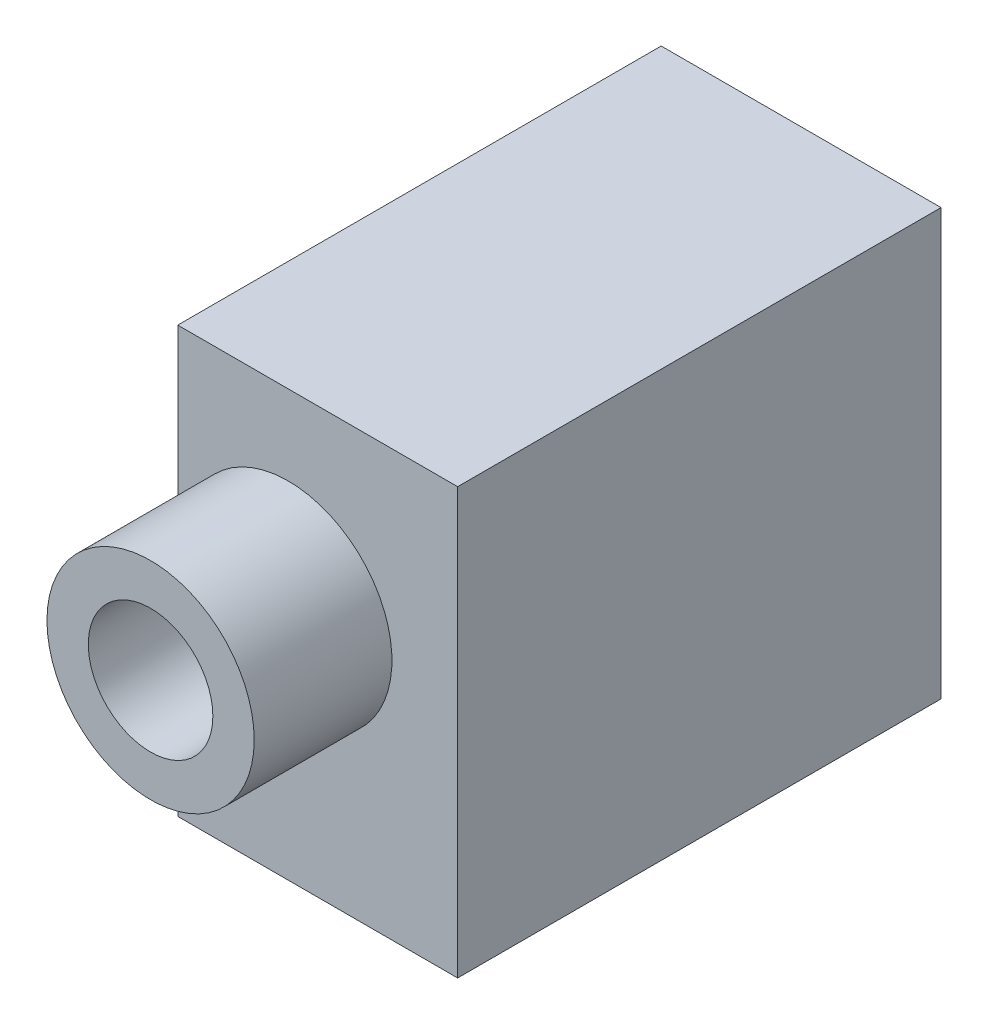
ISO-10303-21;
HEADER;
FILE_DESCRIPTION(('STEP AP214'),'2;1');
FILE_NAME('part.step','',(''),(''),'','','');
FILE_SCHEMA(('AUTOMOTIVE_DESIGN { 1 0 10303 214 1 1 1 1 }'));
ENDSEC;
DATA;
#1=APPLICATION_CONTEXT('core data for automotive mechanical design processes');
#2=APPLICATION_PROTOCOL_DEFINITION('international standard','automotive_design',2000,#1);
#3=PRODUCT_CONTEXT('',#1,'mechanical');
#4=PRODUCT('Part','Part','',(#3));
#5=PRODUCT_RELATED_PRODUCT_CATEGORY('part','',(#4));
#6=PRODUCT_DEFINITION_FORMATION('','',#4);
#7=PRODUCT_DEFINITION_CONTEXT('part definition',#1,'design');
#8=PRODUCT_DEFINITION('design','',#6,#7);
#9=PRODUCT_DEFINITION_SHAPE('','',#8);
#10=(LENGTH_UNIT() NAMED_UNIT(*) SI_UNIT(.MILLI.,.METRE.));
#11=(NAMED_UNIT(*) PLANE_ANGLE_UNIT() SI_UNIT($,.RADIAN.));
#12=(NAMED_UNIT(*) SI_UNIT($,.STERADIAN.) SOLID_ANGLE_UNIT());
#13=UNCERTAINTY_MEASURE_WITH_UNIT(LENGTH_MEASURE(1.E-05),#10,'distance_accuracy_value','');
#14=(GEOMETRIC_REPRESENTATION_CONTEXT(3) GLOBAL_UNCERTAINTY_ASSIGNED_CONTEXT((#13)) GLOBAL_UNIT_ASSIGNED_CONTEXT((#10,
#11,#12)) REPRESENTATION_CONTEXT('',''));
#15=CARTESIAN_POINT('',(0.,0.,0.));
#16=DIRECTION('',(0.,0.,1.));
#17=DIRECTION('',(1.,0.,0.));
#18=AXIS2_PLACEMENT_3D('',#15,#16,#17);
#19=CARTESIAN_POINT('',(-3.2004,12.319,0.));
#20=DIRECTION('',(0.,0.,-1.));
#21=DIRECTION('',(-1.,0.,0.));
#22=AXIS2_PLACEMENT_3D('',#19,#20,#21);
#23=PLANE('',#22);
#24=DIRECTION('',(1.,0.,0.));
#25=VECTOR('',#24,1.);
#26=CARTESIAN_POINT('',(-3.2004,0.,0.));
#27=LINE('',#26,#25);
#28=CARTESIAN_POINT('',(-3.2004,0.,0.));
#29=VERTEX_POINT('',#28);
#30=CARTESIAN_POINT('',(4.9022,0.,0.));
#31=VERTEX_POINT('',#30);
#32=EDGE_CURVE('E93',#29,#31,#27,.T.);
#33=ORIENTED_EDGE('',*,*,#32,.T.);
#34=DIRECTION('',(0.,-1.,0.));
#35=VECTOR('',#34,1.);
#36=CARTESIAN_POINT('',(4.9022,12.319,0.));
#37=LINE('',#36,#35);
#38=CARTESIAN_POINT('',(4.9022,12.319,0.));
#39=VERTEX_POINT('',#38);
#40=EDGE_CURVE('E91',#39,#31,#37,.T.);
#41=ORIENTED_EDGE('',*,*,#40,.F.);
#42=DIRECTION('',(1.,0.,0.));
#43=VECTOR('',#42,1.);
#44=CARTESIAN_POINT('',(-3.2004,12.319,0.));
#45=LINE('',#44,#43);
#46=CARTESIAN_POINT('',(-3.2004,12.319,0.));
#47=VERTEX_POINT('',#46);
#48=EDGE_CURVE('E83',#47,#39,#45,.T.);
#49=ORIENTED_EDGE('',*,*,#48,.F.);
#50=DIRECTION('',(0.,-1.,0.));
#51=VECTOR('',#50,1.);
#52=CARTESIAN_POINT('',(-3.2004,12.319,0.));
#53=LINE('',#52,#51);
#54=EDGE_CURVE('E44',#47,#29,#53,.T.);
#55=ORIENTED_EDGE('',*,*,#54,.T.);
#56=EDGE_LOOP('',(#33,#41,#49,#55));
#57=FACE_BOUND('',#56,.T.);
#58=CARTESIAN_POINT('',(0.,7.0104,0.));
#59=DIRECTION('',(0.,0.,-1.));
#60=DIRECTION('',(-1.,0.,0.));
#61=AXIS2_PLACEMENT_3D('',#58,#59,#60);
#62=CIRCLE('',#61,3.);
#63=CARTESIAN_POINT('',(-3.,7.0104,0.));
#64=VERTEX_POINT('',#63);
#65=EDGE_CURVE('E11',#64,#64,#62,.F.);
#66=ORIENTED_EDGE('',*,*,#65,.F.);
#67=EDGE_LOOP('',(#66));
#68=FACE_BOUND('',#67,.T.);
#69=ADVANCED_FACE('F35',(#57,#68),#23,.F.);
#70=CARTESIAN_POINT('',(-3.2004,12.319,0.));
#71=DIRECTION('',(1.,0.,0.));
#72=DIRECTION('',(0.,0.,-1.));
#73=AXIS2_PLACEMENT_3D('',#70,#71,#72);
#74=PLANE('',#73);
#75=DIRECTION('',(0.,0.,1.));
#76=VECTOR('',#75,1.);
#77=CARTESIAN_POINT('',(-3.2004,0.,0.));
#78=LINE('',#77,#76);
#79=CARTESIAN_POINT('',(-3.2004,0.,-13.9954));
#80=VERTEX_POINT('',#79);
#81=EDGE_CURVE('E102',#80,#29,#78,.T.);
#82=ORIENTED_EDGE('',*,*,#81,.T.);
#83=ORIENTED_EDGE('',*,*,#54,.F.);
#84=DIRECTION('',(0.,0.,1.));
#85=VECTOR('',#84,1.);
#86=CARTESIAN_POINT('',(-3.2004,12.319,0.));
#87=LINE('',#86,#85);
#88=CARTESIAN_POINT('',(-3.2004,12.319,-13.9954));
#89=VERTEX_POINT('',#88);
#90=EDGE_CURVE('E88',#89,#47,#87,.T.);
#91=ORIENTED_EDGE('',*,*,#90,.F.);
#92=DIRECTION('',(0.,-1.,0.));
#93=VECTOR('',#92,1.);
#94=CARTESIAN_POINT('',(-3.2004,12.319,-13.9954));
#95=LINE('',#94,#93);
#96=EDGE_CURVE('E98',#89,#80,#95,.T.);
#97=ORIENTED_EDGE('',*,*,#96,.T.);
#98=EDGE_LOOP('',(#82,#83,#91,#97));
#99=FACE_BOUND('',#98,.T.);
#100=ADVANCED_FACE('F37',(#99),#74,.F.);
#101=CARTESIAN_POINT('',(4.9022,12.319,0.));
#102=DIRECTION('',(-1.,0.,0.));
#103=DIRECTION('',(0.,0.,1.));
#104=AXIS2_PLACEMENT_3D('',#101,#102,#103);
#105=PLANE('',#104);
#106=DIRECTION('',(0.,0.,-1.));
#107=VECTOR('',#106,1.);
#108=CARTESIAN_POINT('',(4.9022,0.,0.));
#109=LINE('',#108,#107);
#110=CARTESIAN_POINT('',(4.9022,0.,-13.9954));
#111=VERTEX_POINT('',#110);
#112=EDGE_CURVE('E69',#31,#111,#109,.T.);
#113=ORIENTED_EDGE('',*,*,#112,.T.);
#114=DIRECTION('',(0.,-1.,0.));
#115=VECTOR('',#114,1.);
#116=CARTESIAN_POINT('',(4.9022,12.319,-13.9954));
#117=LINE('',#116,#115);
#118=CARTESIAN_POINT('',(4.9022,12.319,-13.9954));
#119=VERTEX_POINT('',#118);
#120=EDGE_CURVE('E94',#119,#111,#117,.T.);
#121=ORIENTED_EDGE('',*,*,#120,.F.);
#122=DIRECTION('',(0.,0.,-1.));
#123=VECTOR('',#122,1.);
#124=CARTESIAN_POINT('',(4.9022,12.319,0.));
#125=LINE('',#124,#123);
#126=EDGE_CURVE('E86',#39,#119,#125,.T.);
#127=ORIENTED_EDGE('',*,*,#126,.F.);
#128=ORIENTED_EDGE('',*,*,#40,.T.);
#129=EDGE_LOOP('',(#113,#121,#127,#128));
#130=FACE_BOUND('',#129,.T.);
#131=ADVANCED_FACE('F96',(#130),#105,.F.);
#132=CARTESIAN_POINT('',(-3.2004,12.319,-13.9954));
#133=DIRECTION('',(0.,0.,1.));
#134=DIRECTION('',(1.,0.,0.));
#135=AXIS2_PLACEMENT_3D('',#132,#133,#134);
#136=PLANE('',#135);
#137=DIRECTION('',(-1.,0.,0.));
#138=VECTOR('',#137,1.);
#139=CARTESIAN_POINT('',(-3.2004,0.,-13.9954));
#140=LINE('',#139,#138);
#141=EDGE_CURVE('E75',#111,#80,#140,.T.);
#142=ORIENTED_EDGE('',*,*,#141,.T.);
#143=ORIENTED_EDGE('',*,*,#96,.F.);
#144=DIRECTION('',(-1.,0.,0.));
#145=VECTOR('',#144,1.);
#146=CARTESIAN_POINT('',(-3.2004,12.319,-13.9954));
#147=LINE('',#146,#145);
#148=EDGE_CURVE('E52',#119,#89,#147,.T.);
#149=ORIENTED_EDGE('',*,*,#148,.F.);
#150=ORIENTED_EDGE('',*,*,#120,.T.);
#151=EDGE_LOOP('',(#142,#143,#149,#150));
#152=FACE_BOUND('',#151,.T.);
#153=ADVANCED_FACE('F124',(#152),#136,.F.);
#154=CARTESIAN_POINT('',(0.,12.319,0.));
#155=DIRECTION('',(0.,-1.,0.));
#156=DIRECTION('',(0.,0.,-1.));
#157=AXIS2_PLACEMENT_3D('',#154,#155,#156);
#158=PLANE('',#157);
#159=ORIENTED_EDGE('',*,*,#90,.T.);
#160=ORIENTED_EDGE('',*,*,#48,.T.);
#161=ORIENTED_EDGE('',*,*,#126,.T.);
#162=ORIENTED_EDGE('',*,*,#148,.T.);
#163=EDGE_LOOP('',(#159,#160,#161,#162));
#164=FACE_BOUND('',#163,.T.);
#165=ADVANCED_FACE('F84',(#164),#158,.F.);
#166=CARTESIAN_POINT('',(0.,0.,0.));
#167=DIRECTION('',(0.,-1.,0.));
#168=DIRECTION('',(0.,0.,-1.));
#169=AXIS2_PLACEMENT_3D('',#166,#167,#168);
#170=PLANE('',#169);
#171=ORIENTED_EDGE('',*,*,#81,.F.);
#172=ORIENTED_EDGE('',*,*,#141,.F.);
#173=ORIENTED_EDGE('',*,*,#112,.F.);
#174=ORIENTED_EDGE('',*,*,#32,.F.);
#175=EDGE_LOOP('',(#171,#172,#173,#174));
#176=FACE_BOUND('',#175,.T.);
#177=ADVANCED_FACE('F113',(#176),#170,.T.);
#178=CARTESIAN_POINT('',(0.,7.0104,3.9878));
#179=DIRECTION('',(0.,0.,1.));
#180=DIRECTION('',(1.,0.,0.));
#181=AXIS2_PLACEMENT_3D('',#178,#179,#180);
#182=PLANE('',#181);
#183=CARTESIAN_POINT('',(0.,7.0104,3.9878));
#184=DIRECTION('',(0.,0.,1.));
#185=DIRECTION('',(1.,0.,0.));
#186=AXIS2_PLACEMENT_3D('',#183,#184,#185);
#187=CIRCLE('',#186,3.);
#188=CARTESIAN_POINT('',(3.,7.0104,3.9878));
#189=VERTEX_POINT('',#188);
#190=EDGE_CURVE('E105',#189,#189,#187,.T.);
#191=ORIENTED_EDGE('',*,*,#190,.T.);
#192=EDGE_LOOP('',(#191));
#193=FACE_BOUND('',#192,.T.);
#194=CARTESIAN_POINT('',(0.,7.0104,3.9878));
#195=DIRECTION('',(0.,0.,1.));
#196=DIRECTION('',(1.,0.,0.));
#197=AXIS2_PLACEMENT_3D('',#194,#195,#196);
#198=CIRCLE('',#197,1.8034);
#199=CARTESIAN_POINT('',(1.8034,7.0104,3.9878));
#200=VERTEX_POINT('',#199);
#201=EDGE_CURVE('E145',#200,#200,#198,.T.);
#202=ORIENTED_EDGE('',*,*,#201,.F.);
#203=EDGE_LOOP('',(#202));
#204=FACE_BOUND('',#203,.T.);
#205=ADVANCED_FACE('F115',(#193,#204),#182,.T.);
#206=CARTESIAN_POINT('',(0.,7.0104,3.9878));
#207=DIRECTION('',(0.,0.,-1.));
#208=DIRECTION('',(-1.,0.,0.));
#209=AXIS2_PLACEMENT_3D('',#206,#207,#208);
#210=CYLINDRICAL_SURFACE('',#209,3.);
#211=ORIENTED_EDGE('',*,*,#190,.F.);
#212=EDGE_LOOP('',(#211));
#213=FACE_BOUND('',#212,.T.);
#214=ORIENTED_EDGE('',*,*,#65,.T.);
#215=EDGE_LOOP('',(#214));
#216=FACE_BOUND('',#215,.T.);
#217=ADVANCED_FACE('F121',(#213,#216),#210,.T.);
#218=CARTESIAN_POINT('',(0.,7.0104,3.9878));
#219=DIRECTION('',(0.,0.,-1.));
#220=DIRECTION('',(-1.,0.,0.));
#221=AXIS2_PLACEMENT_3D('',#218,#219,#220);
#222=CYLINDRICAL_SURFACE('',#221,1.8034);
#223=ORIENTED_EDGE('',*,*,#201,.T.);
#224=EDGE_LOOP('',(#223));
#225=FACE_BOUND('',#224,.T.);
#226=CARTESIAN_POINT('',(0.,7.0104,0.));
#227=DIRECTION('',(0.,0.,1.));
#228=DIRECTION('',(1.,0.,0.));
#229=AXIS2_PLACEMENT_3D('',#226,#227,#228);
#230=CIRCLE('',#229,1.8034);
#231=CARTESIAN_POINT('',(1.8034,7.0104,0.));
#232=VERTEX_POINT('',#231);
#233=EDGE_CURVE('E143',#232,#232,#230,.T.);
#234=ORIENTED_EDGE('',*,*,#233,.F.);
#235=EDGE_LOOP('',(#234));
#236=FACE_BOUND('',#235,.T.);
#237=ADVANCED_FACE('F134',(#225,#236),#222,.F.);
#238=ORIENTED_EDGE('',*,*,#233,.T.);
#239=EDGE_LOOP('',(#238));
#240=FACE_BOUND('',#239,.T.);
#241=ADVANCED_FACE('F128',(#240),#23,.F.);
#242=CLOSED_SHELL('',(#69,#100,#131,#153,#165,#177,#205,#217,#237,#241));
#243=MANIFOLD_SOLID_BREP('B2',#242);
#244=ADVANCED_BREP_SHAPE_REPRESENTATION('',(#18,#243),#14);
#245=SHAPE_DEFINITION_REPRESENTATION(#9,#244);
ENDSEC;
END-ISO-10303-21;
